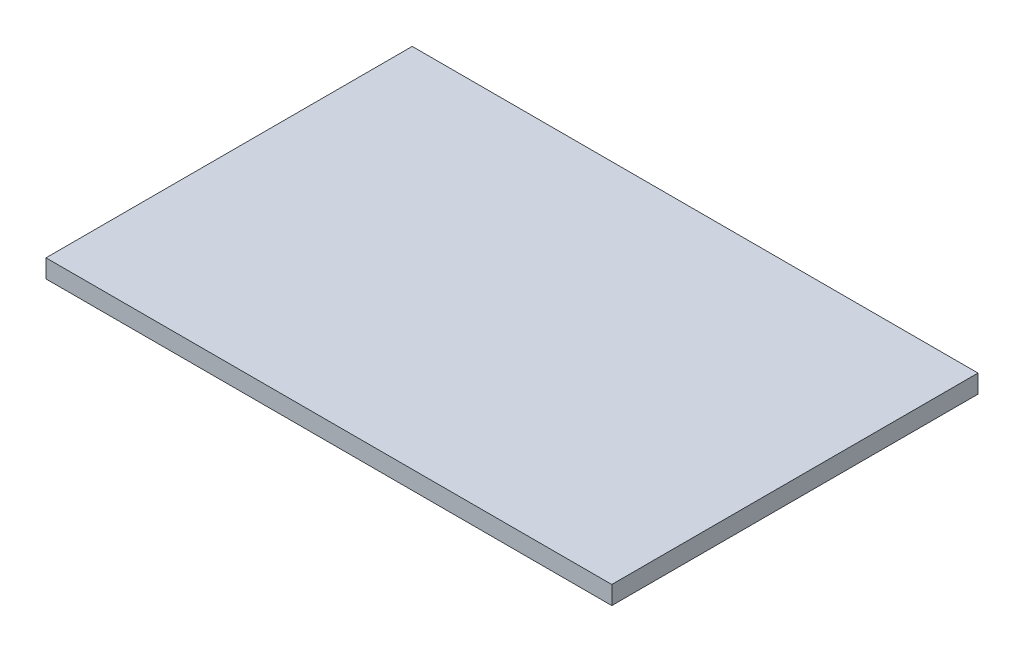
ISO-10303-21;
HEADER;
FILE_DESCRIPTION(('STEP AP214'),'2;1');
FILE_NAME('part.step','',(''),(''),'','','');
FILE_SCHEMA(('AUTOMOTIVE_DESIGN { 1 0 10303 214 1 1 1 1 }'));
ENDSEC;
DATA;
#1=APPLICATION_CONTEXT('core data for automotive mechanical design processes');
#2=APPLICATION_PROTOCOL_DEFINITION('international standard','automotive_design',2000,#1);
#3=PRODUCT_CONTEXT('',#1,'mechanical');
#4=PRODUCT('Part','Part','',(#3));
#5=PRODUCT_RELATED_PRODUCT_CATEGORY('part','',(#4));
#6=PRODUCT_DEFINITION_FORMATION('','',#4);
#7=PRODUCT_DEFINITION_CONTEXT('part definition',#1,'design');
#8=PRODUCT_DEFINITION('design','',#6,#7);
#9=PRODUCT_DEFINITION_SHAPE('','',#8);
#10=(LENGTH_UNIT() NAMED_UNIT(*) SI_UNIT(.MILLI.,.METRE.));
#11=(NAMED_UNIT(*) PLANE_ANGLE_UNIT() SI_UNIT($,.RADIAN.));
#12=(NAMED_UNIT(*) SI_UNIT($,.STERADIAN.) SOLID_ANGLE_UNIT());
#13=UNCERTAINTY_MEASURE_WITH_UNIT(LENGTH_MEASURE(1.E-05),#10,'distance_accuracy_value','');
#14=(GEOMETRIC_REPRESENTATION_CONTEXT(3) GLOBAL_UNCERTAINTY_ASSIGNED_CONTEXT((#13)) GLOBAL_UNIT_ASSIGNED_CONTEXT((#10,
#11,#12)) REPRESENTATION_CONTEXT('',''));
#15=CARTESIAN_POINT('',(0.,0.,0.));
#16=DIRECTION('',(0.,0.,1.));
#17=DIRECTION('',(1.,0.,0.));
#18=AXIS2_PLACEMENT_3D('',#15,#16,#17);
#19=CARTESIAN_POINT('',(0.,10.,0.));
#20=DIRECTION('',(1.,0.,0.));
#21=DIRECTION('',(0.,0.,-1.));
#22=AXIS2_PLACEMENT_3D('',#19,#20,#21);
#23=PLANE('',#22);
#24=DIRECTION('',(0.,0.,1.));
#25=VECTOR('',#24,1.);
#26=CARTESIAN_POINT('',(0.,0.,0.));
#27=LINE('',#26,#25);
#28=CARTESIAN_POINT('',(0.,0.,-200.));
#29=VERTEX_POINT('',#28);
#30=CARTESIAN_POINT('',(0.,0.,0.));
#31=VERTEX_POINT('',#30);
#32=EDGE_CURVE('E107',#29,#31,#27,.T.);
#33=ORIENTED_EDGE('',*,*,#32,.T.);
#34=DIRECTION('',(0.,-1.,0.));
#35=VECTOR('',#34,1.);
#36=CARTESIAN_POINT('',(0.,10.,0.));
#37=LINE('',#36,#35);
#38=CARTESIAN_POINT('',(0.,10.,0.));
#39=VERTEX_POINT('',#38);
#40=EDGE_CURVE('E11',#39,#31,#37,.T.);
#41=ORIENTED_EDGE('',*,*,#40,.F.);
#42=DIRECTION('',(0.,0.,1.));
#43=VECTOR('',#42,1.);
#44=CARTESIAN_POINT('',(0.,10.,0.));
#45=LINE('',#44,#43);
#46=CARTESIAN_POINT('',(0.,10.,-200.));
#47=VERTEX_POINT('',#46);
#48=EDGE_CURVE('E91',#47,#39,#45,.T.);
#49=ORIENTED_EDGE('',*,*,#48,.F.);
#50=DIRECTION('',(0.,-1.,0.));
#51=VECTOR('',#50,1.);
#52=CARTESIAN_POINT('',(0.,10.,-200.));
#53=LINE('',#52,#51);
#54=EDGE_CURVE('E103',#47,#29,#53,.T.);
#55=ORIENTED_EDGE('',*,*,#54,.T.);
#56=EDGE_LOOP('',(#33,#41,#49,#55));
#57=FACE_BOUND('',#56,.T.);
#58=ADVANCED_FACE('F39',(#57),#23,.F.);
#59=CARTESIAN_POINT('',(0.,10.,0.));
#60=DIRECTION('',(0.,0.,-1.));
#61=DIRECTION('',(-1.,0.,0.));
#62=AXIS2_PLACEMENT_3D('',#59,#60,#61);
#63=PLANE('',#62);
#64=DIRECTION('',(1.,0.,0.));
#65=VECTOR('',#64,1.);
#66=CARTESIAN_POINT('',(0.,0.,0.));
#67=LINE('',#66,#65);
#68=CARTESIAN_POINT('',(309.,0.,0.));
#69=VERTEX_POINT('',#68);
#70=EDGE_CURVE('E96',#31,#69,#67,.T.);
#71=ORIENTED_EDGE('',*,*,#70,.T.);
#72=DIRECTION('',(0.,-1.,0.));
#73=VECTOR('',#72,1.);
#74=CARTESIAN_POINT('',(309.,10.,0.));
#75=LINE('',#74,#73);
#76=CARTESIAN_POINT('',(309.,10.,0.));
#77=VERTEX_POINT('',#76);
#78=EDGE_CURVE('E48',#77,#69,#75,.T.);
#79=ORIENTED_EDGE('',*,*,#78,.F.);
#80=DIRECTION('',(1.,0.,0.));
#81=VECTOR('',#80,1.);
#82=CARTESIAN_POINT('',(0.,10.,0.));
#83=LINE('',#82,#81);
#84=EDGE_CURVE('E86',#39,#77,#83,.T.);
#85=ORIENTED_EDGE('',*,*,#84,.F.);
#86=ORIENTED_EDGE('',*,*,#40,.T.);
#87=EDGE_LOOP('',(#71,#79,#85,#86));
#88=FACE_BOUND('',#87,.T.);
#89=ADVANCED_FACE('F95',(#88),#63,.F.);
#90=CARTESIAN_POINT('',(309.,10.,0.));
#91=DIRECTION('',(-1.,0.,0.));
#92=DIRECTION('',(0.,0.,1.));
#93=AXIS2_PLACEMENT_3D('',#90,#91,#92);
#94=PLANE('',#93);
#95=DIRECTION('',(0.,0.,-1.));
#96=VECTOR('',#95,1.);
#97=CARTESIAN_POINT('',(309.,0.,0.));
#98=LINE('',#97,#96);
#99=CARTESIAN_POINT('',(309.,0.,-200.));
#100=VERTEX_POINT('',#99);
#101=EDGE_CURVE('E73',#69,#100,#98,.T.);
#102=ORIENTED_EDGE('',*,*,#101,.T.);
#103=DIRECTION('',(0.,-1.,0.));
#104=VECTOR('',#103,1.);
#105=CARTESIAN_POINT('',(309.,10.,-200.));
#106=LINE('',#105,#104);
#107=CARTESIAN_POINT('',(309.,10.,-200.));
#108=VERTEX_POINT('',#107);
#109=EDGE_CURVE('E98',#108,#100,#106,.T.);
#110=ORIENTED_EDGE('',*,*,#109,.F.);
#111=DIRECTION('',(0.,0.,-1.));
#112=VECTOR('',#111,1.);
#113=CARTESIAN_POINT('',(309.,10.,0.));
#114=LINE('',#113,#112);
#115=EDGE_CURVE('E89',#77,#108,#114,.T.);
#116=ORIENTED_EDGE('',*,*,#115,.F.);
#117=ORIENTED_EDGE('',*,*,#78,.T.);
#118=EDGE_LOOP('',(#102,#110,#116,#117));
#119=FACE_BOUND('',#118,.T.);
#120=ADVANCED_FACE('F99',(#119),#94,.F.);
#121=CARTESIAN_POINT('',(0.,10.,-200.));
#122=DIRECTION('',(0.,0.,1.));
#123=DIRECTION('',(1.,0.,0.));
#124=AXIS2_PLACEMENT_3D('',#121,#122,#123);
#125=PLANE('',#124);
#126=DIRECTION('',(-1.,0.,0.));
#127=VECTOR('',#126,1.);
#128=CARTESIAN_POINT('',(0.,0.,-200.));
#129=LINE('',#128,#127);
#130=EDGE_CURVE('E79',#100,#29,#129,.T.);
#131=ORIENTED_EDGE('',*,*,#130,.T.);
#132=ORIENTED_EDGE('',*,*,#54,.F.);
#133=DIRECTION('',(-1.,0.,0.));
#134=VECTOR('',#133,1.);
#135=CARTESIAN_POINT('',(0.,10.,-200.));
#136=LINE('',#135,#134);
#137=EDGE_CURVE('E56',#108,#47,#136,.T.);
#138=ORIENTED_EDGE('',*,*,#137,.F.);
#139=ORIENTED_EDGE('',*,*,#109,.T.);
#140=EDGE_LOOP('',(#131,#132,#138,#139));
#141=FACE_BOUND('',#140,.T.);
#142=ADVANCED_FACE('F120',(#141),#125,.F.);
#143=CARTESIAN_POINT('',(0.,10.,0.));
#144=DIRECTION('',(0.,-1.,0.));
#145=DIRECTION('',(0.,0.,-1.));
#146=AXIS2_PLACEMENT_3D('',#143,#144,#145);
#147=PLANE('',#146);
#148=ORIENTED_EDGE('',*,*,#48,.T.);
#149=ORIENTED_EDGE('',*,*,#84,.T.);
#150=ORIENTED_EDGE('',*,*,#115,.T.);
#151=ORIENTED_EDGE('',*,*,#137,.T.);
#152=EDGE_LOOP('',(#148,#149,#150,#151));
#153=FACE_BOUND('',#152,.T.);
#154=ADVANCED_FACE('F87',(#153),#147,.F.);
#155=CARTESIAN_POINT('',(0.,0.,0.));
#156=DIRECTION('',(0.,-1.,0.));
#157=DIRECTION('',(0.,0.,-1.));
#158=AXIS2_PLACEMENT_3D('',#155,#156,#157);
#159=PLANE('',#158);
#160=ORIENTED_EDGE('',*,*,#32,.F.);
#161=ORIENTED_EDGE('',*,*,#130,.F.);
#162=ORIENTED_EDGE('',*,*,#101,.F.);
#163=ORIENTED_EDGE('',*,*,#70,.F.);
#164=EDGE_LOOP('',(#160,#161,#162,#163));
#165=FACE_BOUND('',#164,.T.);
#166=ADVANCED_FACE('F123',(#165),#159,.T.);
#167=CLOSED_SHELL('',(#58,#89,#120,#142,#154,#166));
#168=MANIFOLD_SOLID_BREP('B2',#167);
#169=ADVANCED_BREP_SHAPE_REPRESENTATION('',(#18,#168),#14);
#170=SHAPE_DEFINITION_REPRESENTATION(#9,#169);
ENDSEC;
END-ISO-10303-21;
